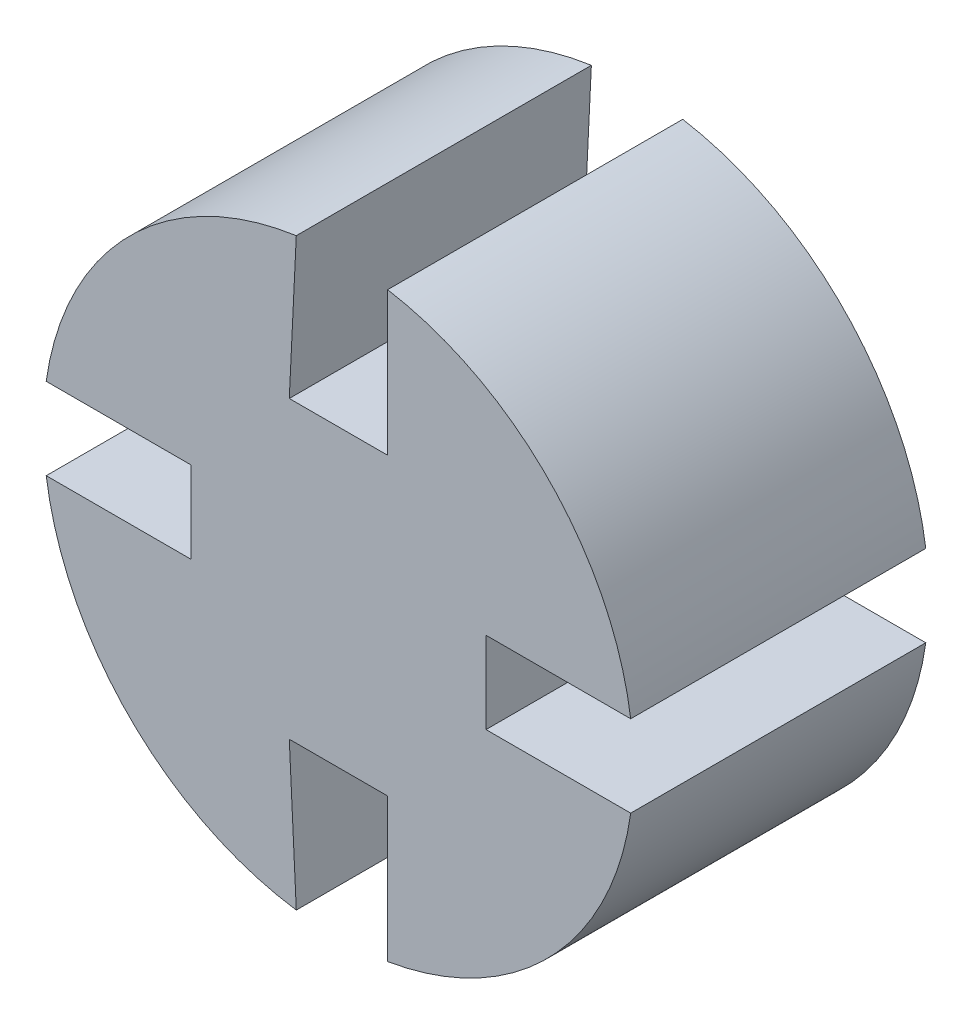
ISO-10303-21;
HEADER;
FILE_DESCRIPTION(('STEP AP214'),'2;1');
FILE_NAME('part.step','',(''),(''),'','','');
FILE_SCHEMA(('AUTOMOTIVE_DESIGN { 1 0 10303 214 1 1 1 1 }'));
ENDSEC;
DATA;
#1=APPLICATION_CONTEXT('core data for automotive mechanical design processes');
#2=APPLICATION_PROTOCOL_DEFINITION('international standard','automotive_design',2000,#1);
#3=PRODUCT_CONTEXT('',#1,'mechanical');
#4=PRODUCT('Part','Part','',(#3));
#5=PRODUCT_RELATED_PRODUCT_CATEGORY('part','',(#4));
#6=PRODUCT_DEFINITION_FORMATION('','',#4);
#7=PRODUCT_DEFINITION_CONTEXT('part definition',#1,'design');
#8=PRODUCT_DEFINITION('design','',#6,#7);
#9=PRODUCT_DEFINITION_SHAPE('','',#8);
#10=(LENGTH_UNIT() NAMED_UNIT(*) SI_UNIT(.MILLI.,.METRE.));
#11=(NAMED_UNIT(*) PLANE_ANGLE_UNIT() SI_UNIT($,.RADIAN.));
#12=(NAMED_UNIT(*) SI_UNIT($,.STERADIAN.) SOLID_ANGLE_UNIT());
#13=UNCERTAINTY_MEASURE_WITH_UNIT(LENGTH_MEASURE(1.E-05),#10,'distance_accuracy_value','');
#14=(GEOMETRIC_REPRESENTATION_CONTEXT(3) GLOBAL_UNCERTAINTY_ASSIGNED_CONTEXT((#13)) GLOBAL_UNIT_ASSIGNED_CONTEXT((#10,
#11,#12)) REPRESENTATION_CONTEXT('',''));
#15=CARTESIAN_POINT('',(0.,0.,0.));
#16=DIRECTION('',(0.,0.,1.));
#17=DIRECTION('',(1.,0.,0.));
#18=AXIS2_PLACEMENT_3D('',#15,#16,#17);
#19=CARTESIAN_POINT('',(0.,0.,60.));
#20=DIRECTION('',(0.,0.,-1.));
#21=DIRECTION('',(-1.,0.,0.));
#22=AXIS2_PLACEMENT_3D('',#19,#20,#21);
#23=CYLINDRICAL_SURFACE('',#22,60.);
#24=CARTESIAN_POINT('',(0.,0.,0.));
#25=DIRECTION('',(0.,0.,1.));
#26=DIRECTION('',(1.,0.,0.));
#27=AXIS2_PLACEMENT_3D('',#24,#25,#26);
#28=CIRCLE('',#27,60.);
#29=CARTESIAN_POINT('',(59.422289673642,8.30611160181319,0.));
#30=VERTEX_POINT('',#29);
#31=CARTESIAN_POINT('',(10.,59.1607978309962,0.));
#32=VERTEX_POINT('',#31);
#33=EDGE_CURVE('E177',#30,#32,#28,.T.);
#34=ORIENTED_EDGE('',*,*,#33,.T.);
#35=DIRECTION('',(0.,0.,-1.));
#36=VECTOR('',#35,1.);
#37=CARTESIAN_POINT('',(10.,59.1607978309962,60.));
#38=LINE('',#37,#36);
#39=CARTESIAN_POINT('',(10.,59.1607978309962,60.));
#40=VERTEX_POINT('',#39);
#41=EDGE_CURVE('E11',#40,#32,#38,.T.);
#42=ORIENTED_EDGE('',*,*,#41,.F.);
#43=CARTESIAN_POINT('',(0.,0.,60.));
#44=DIRECTION('',(0.,0.,1.));
#45=DIRECTION('',(1.,0.,0.));
#46=AXIS2_PLACEMENT_3D('',#43,#44,#45);
#47=CIRCLE('',#46,60.);
#48=CARTESIAN_POINT('',(59.422289673642,8.30611160181319,60.));
#49=VERTEX_POINT('',#48);
#50=EDGE_CURVE('E207',#49,#40,#47,.T.);
#51=ORIENTED_EDGE('',*,*,#50,.F.);
#52=DIRECTION('',(0.,0.,-1.));
#53=VECTOR('',#52,1.);
#54=CARTESIAN_POINT('',(59.422289673642,8.30611160181319,60.));
#55=LINE('',#54,#53);
#56=EDGE_CURVE('E173',#49,#30,#55,.T.);
#57=ORIENTED_EDGE('',*,*,#56,.T.);
#58=EDGE_LOOP('',(#34,#42,#51,#57));
#59=FACE_BOUND('',#58,.T.);
#60=ADVANCED_FACE('F33',(#59),#23,.T.);
#61=CARTESIAN_POINT('',(10.,59.1607978309962,60.));
#62=DIRECTION('',(1.,0.,0.));
#63=DIRECTION('',(0.,1.,0.));
#64=AXIS2_PLACEMENT_3D('',#61,#62,#63);
#65=PLANE('',#64);
#66=DIRECTION('',(0.,-1.,0.));
#67=VECTOR('',#66,1.);
#68=CARTESIAN_POINT('',(10.,59.1607978309962,0.));
#69=LINE('',#68,#67);
#70=CARTESIAN_POINT('',(9.99999999999999,30.,0.));
#71=VERTEX_POINT('',#70);
#72=EDGE_CURVE('E180',#32,#71,#69,.T.);
#73=ORIENTED_EDGE('',*,*,#72,.T.);
#74=DIRECTION('',(0.,0.,-1.));
#75=VECTOR('',#74,1.);
#76=CARTESIAN_POINT('',(9.99999999999999,30.,60.));
#77=LINE('',#76,#75);
#78=CARTESIAN_POINT('',(9.99999999999999,30.,60.));
#79=VERTEX_POINT('',#78);
#80=EDGE_CURVE('E41',#79,#71,#77,.T.);
#81=ORIENTED_EDGE('',*,*,#80,.F.);
#82=DIRECTION('',(0.,-1.,0.));
#83=VECTOR('',#82,1.);
#84=CARTESIAN_POINT('',(10.,59.1607978309962,60.));
#85=LINE('',#84,#83);
#86=EDGE_CURVE('E116',#40,#79,#85,.T.);
#87=ORIENTED_EDGE('',*,*,#86,.F.);
#88=ORIENTED_EDGE('',*,*,#41,.T.);
#89=EDGE_LOOP('',(#73,#81,#87,#88));
#90=FACE_BOUND('',#89,.T.);
#91=ADVANCED_FACE('F305',(#90),#65,.F.);
#92=CARTESIAN_POINT('',(-10.,30.,60.));
#93=DIRECTION('',(0.,-1.,0.));
#94=DIRECTION('',(1.,0.,0.));
#95=AXIS2_PLACEMENT_3D('',#92,#93,#94);
#96=PLANE('',#95);
#97=DIRECTION('',(-1.,0.,0.));
#98=VECTOR('',#97,1.);
#99=CARTESIAN_POINT('',(-10.,30.,0.));
#100=LINE('',#99,#98);
#101=CARTESIAN_POINT('',(-10.,30.,0.));
#102=VERTEX_POINT('',#101);
#103=EDGE_CURVE('E182',#71,#102,#100,.T.);
#104=ORIENTED_EDGE('',*,*,#103,.T.);
#105=DIRECTION('',(0.,0.,-1.));
#106=VECTOR('',#105,1.);
#107=CARTESIAN_POINT('',(-10.,30.,60.));
#108=LINE('',#107,#106);
#109=CARTESIAN_POINT('',(-10.,30.,60.));
#110=VERTEX_POINT('',#109);
#111=EDGE_CURVE('E238',#110,#102,#108,.T.);
#112=ORIENTED_EDGE('',*,*,#111,.F.);
#113=DIRECTION('',(-1.,0.,0.));
#114=VECTOR('',#113,1.);
#115=CARTESIAN_POINT('',(-10.,30.,60.));
#116=LINE('',#115,#114);
#117=EDGE_CURVE('E246',#79,#110,#116,.T.);
#118=ORIENTED_EDGE('',*,*,#117,.F.);
#119=ORIENTED_EDGE('',*,*,#80,.T.);
#120=EDGE_LOOP('',(#104,#112,#118,#119));
#121=FACE_BOUND('',#120,.T.);
#122=ADVANCED_FACE('F244',(#121),#96,.F.);
#123=CARTESIAN_POINT('',(-8.57523763049704,59.3840492016207,60.));
#124=DIRECTION('',(-0.998826544486309,0.0484307137004888,0.));
#125=DIRECTION('',(-0.0484307137004888,-0.998826544486309,0.));
#126=AXIS2_PLACEMENT_3D('',#123,#124,#125);
#127=PLANE('',#126);
#128=DIRECTION('',(0.0484307137004888,0.998826544486309,0.));
#129=VECTOR('',#128,1.);
#130=CARTESIAN_POINT('',(-8.57523763049704,59.3840492016207,0.));
#131=LINE('',#130,#129);
#132=CARTESIAN_POINT('',(-8.57523763049704,59.3840492016207,0.));
#133=VERTEX_POINT('',#132);
#134=EDGE_CURVE('E184',#102,#133,#131,.T.);
#135=ORIENTED_EDGE('',*,*,#134,.T.);
#136=DIRECTION('',(0.,0.,-1.));
#137=VECTOR('',#136,1.);
#138=CARTESIAN_POINT('',(-8.57523763049704,59.3840492016207,60.));
#139=LINE('',#138,#137);
#140=CARTESIAN_POINT('',(-8.57523763049704,59.3840492016207,60.));
#141=VERTEX_POINT('',#140);
#142=EDGE_CURVE('E235',#141,#133,#139,.T.);
#143=ORIENTED_EDGE('',*,*,#142,.F.);
#144=DIRECTION('',(0.0484307137004888,0.998826544486309,0.));
#145=VECTOR('',#144,1.);
#146=CARTESIAN_POINT('',(-8.57523763049704,59.3840492016207,60.));
#147=LINE('',#146,#145);
#148=EDGE_CURVE('E264',#110,#141,#147,.T.);
#149=ORIENTED_EDGE('',*,*,#148,.F.);
#150=ORIENTED_EDGE('',*,*,#111,.T.);
#151=EDGE_LOOP('',(#135,#143,#149,#150));
#152=FACE_BOUND('',#151,.T.);
#153=ADVANCED_FACE('F255',(#152),#127,.F.);
#154=CARTESIAN_POINT('',(0.,0.,60.));
#155=DIRECTION('',(0.,0.,-1.));
#156=DIRECTION('',(-1.,0.,0.));
#157=AXIS2_PLACEMENT_3D('',#154,#155,#156);
#158=CYLINDRICAL_SURFACE('',#157,60.);
#159=CARTESIAN_POINT('',(0.,0.,0.));
#160=DIRECTION('',(0.,0.,1.));
#161=DIRECTION('',(1.,0.,0.));
#162=AXIS2_PLACEMENT_3D('',#159,#160,#161);
#163=CIRCLE('',#162,60.);
#164=CARTESIAN_POINT('',(-59.422289673642,8.30611160181319,0.));
#165=VERTEX_POINT('',#164);
#166=EDGE_CURVE('E186',#133,#165,#163,.T.);
#167=ORIENTED_EDGE('',*,*,#166,.T.);
#168=DIRECTION('',(0.,0.,-1.));
#169=VECTOR('',#168,1.);
#170=CARTESIAN_POINT('',(-59.422289673642,8.30611160181319,60.));
#171=LINE('',#170,#169);
#172=CARTESIAN_POINT('',(-59.422289673642,8.30611160181319,60.));
#173=VERTEX_POINT('',#172);
#174=EDGE_CURVE('E232',#173,#165,#171,.T.);
#175=ORIENTED_EDGE('',*,*,#174,.F.);
#176=CARTESIAN_POINT('',(0.,0.,60.));
#177=DIRECTION('',(0.,0.,1.));
#178=DIRECTION('',(1.,0.,0.));
#179=AXIS2_PLACEMENT_3D('',#176,#177,#178);
#180=CIRCLE('',#179,60.);
#181=EDGE_CURVE('E261',#141,#173,#180,.T.);
#182=ORIENTED_EDGE('',*,*,#181,.F.);
#183=ORIENTED_EDGE('',*,*,#142,.T.);
#184=EDGE_LOOP('',(#167,#175,#182,#183));
#185=FACE_BOUND('',#184,.T.);
#186=ADVANCED_FACE('F259',(#185),#158,.T.);
#187=CARTESIAN_POINT('',(-59.422289673642,8.30611160181319,60.));
#188=DIRECTION('',(0.,1.,0.));
#189=DIRECTION('',(0.,0.,1.));
#190=AXIS2_PLACEMENT_3D('',#187,#188,#189);
#191=PLANE('',#190);
#192=DIRECTION('',(1.,0.,0.));
#193=VECTOR('',#192,1.);
#194=CARTESIAN_POINT('',(-59.422289673642,8.30611160181319,0.));
#195=LINE('',#194,#193);
#196=CARTESIAN_POINT('',(-30.,8.30611160181319,0.));
#197=VERTEX_POINT('',#196);
#198=EDGE_CURVE('E188',#165,#197,#195,.T.);
#199=ORIENTED_EDGE('',*,*,#198,.T.);
#200=DIRECTION('',(0.,0.,-1.));
#201=VECTOR('',#200,1.);
#202=CARTESIAN_POINT('',(-30.,8.30611160181319,60.));
#203=LINE('',#202,#201);
#204=CARTESIAN_POINT('',(-30.,8.30611160181319,60.));
#205=VERTEX_POINT('',#204);
#206=EDGE_CURVE('E229',#205,#197,#203,.T.);
#207=ORIENTED_EDGE('',*,*,#206,.F.);
#208=DIRECTION('',(1.,0.,0.));
#209=VECTOR('',#208,1.);
#210=CARTESIAN_POINT('',(-59.422289673642,8.30611160181319,60.));
#211=LINE('',#210,#209);
#212=EDGE_CURVE('E263',#173,#205,#211,.T.);
#213=ORIENTED_EDGE('',*,*,#212,.F.);
#214=ORIENTED_EDGE('',*,*,#174,.T.);
#215=EDGE_LOOP('',(#199,#207,#213,#214));
#216=FACE_BOUND('',#215,.T.);
#217=ADVANCED_FACE('F318',(#216),#191,.F.);
#218=CARTESIAN_POINT('',(-30.,8.30611160181319,60.));
#219=DIRECTION('',(1.,0.,0.));
#220=DIRECTION('',(0.,0.,-1.));
#221=AXIS2_PLACEMENT_3D('',#218,#219,#220);
#222=PLANE('',#221);
#223=DIRECTION('',(0.,-1.,0.));
#224=VECTOR('',#223,1.);
#225=CARTESIAN_POINT('',(-30.,8.30611160181319,0.));
#226=LINE('',#225,#224);
#227=CARTESIAN_POINT('',(-30.,-8.30611160181316,0.));
#228=VERTEX_POINT('',#227);
#229=EDGE_CURVE('E190',#197,#228,#226,.T.);
#230=ORIENTED_EDGE('',*,*,#229,.T.);
#231=DIRECTION('',(0.,0.,-1.));
#232=VECTOR('',#231,1.);
#233=CARTESIAN_POINT('',(-30.,-8.30611160181316,60.));
#234=LINE('',#233,#232);
#235=CARTESIAN_POINT('',(-30.,-8.30611160181316,60.));
#236=VERTEX_POINT('',#235);
#237=EDGE_CURVE('E226',#236,#228,#234,.T.);
#238=ORIENTED_EDGE('',*,*,#237,.F.);
#239=DIRECTION('',(0.,-1.,0.));
#240=VECTOR('',#239,1.);
#241=CARTESIAN_POINT('',(-30.,8.30611160181319,60.));
#242=LINE('',#241,#240);
#243=EDGE_CURVE('E266',#205,#236,#242,.T.);
#244=ORIENTED_EDGE('',*,*,#243,.F.);
#245=ORIENTED_EDGE('',*,*,#206,.T.);
#246=EDGE_LOOP('',(#230,#238,#244,#245));
#247=FACE_BOUND('',#246,.T.);
#248=ADVANCED_FACE('F321',(#247),#222,.F.);
#249=CARTESIAN_POINT('',(-59.422289673642,-8.30611160181317,60.));
#250=DIRECTION('',(0.,-1.,0.));
#251=DIRECTION('',(1.,0.,0.));
#252=AXIS2_PLACEMENT_3D('',#249,#250,#251);
#253=PLANE('',#252);
#254=DIRECTION('',(-1.,0.,0.));
#255=VECTOR('',#254,1.);
#256=CARTESIAN_POINT('',(-59.422289673642,-8.30611160181317,0.));
#257=LINE('',#256,#255);
#258=CARTESIAN_POINT('',(-59.422289673642,-8.30611160181317,0.));
#259=VERTEX_POINT('',#258);
#260=EDGE_CURVE('E192',#228,#259,#257,.T.);
#261=ORIENTED_EDGE('',*,*,#260,.T.);
#262=DIRECTION('',(0.,0.,-1.));
#263=VECTOR('',#262,1.);
#264=CARTESIAN_POINT('',(-59.422289673642,-8.30611160181317,60.));
#265=LINE('',#264,#263);
#266=CARTESIAN_POINT('',(-59.422289673642,-8.30611160181317,60.));
#267=VERTEX_POINT('',#266);
#268=EDGE_CURVE('E223',#267,#259,#265,.T.);
#269=ORIENTED_EDGE('',*,*,#268,.F.);
#270=DIRECTION('',(-1.,0.,0.));
#271=VECTOR('',#270,1.);
#272=CARTESIAN_POINT('',(-59.422289673642,-8.30611160181317,60.));
#273=LINE('',#272,#271);
#274=EDGE_CURVE('E272',#236,#267,#273,.T.);
#275=ORIENTED_EDGE('',*,*,#274,.F.);
#276=ORIENTED_EDGE('',*,*,#237,.T.);
#277=EDGE_LOOP('',(#261,#269,#275,#276));
#278=FACE_BOUND('',#277,.T.);
#279=ADVANCED_FACE('F325',(#278),#253,.F.);
#280=CARTESIAN_POINT('',(0.,0.,60.));
#281=DIRECTION('',(0.,0.,-1.));
#282=DIRECTION('',(-1.,0.,0.));
#283=AXIS2_PLACEMENT_3D('',#280,#281,#282);
#284=CYLINDRICAL_SURFACE('',#283,60.);
#285=CARTESIAN_POINT('',(0.,0.,0.));
#286=DIRECTION('',(0.,0.,1.));
#287=DIRECTION('',(1.,0.,0.));
#288=AXIS2_PLACEMENT_3D('',#285,#286,#287);
#289=CIRCLE('',#288,60.);
#290=CARTESIAN_POINT('',(-8.57523763049706,-59.3840492016207,0.));
#291=VERTEX_POINT('',#290);
#292=EDGE_CURVE('E194',#259,#291,#289,.T.);
#293=ORIENTED_EDGE('',*,*,#292,.T.);
#294=DIRECTION('',(0.,0.,-1.));
#295=VECTOR('',#294,1.);
#296=CARTESIAN_POINT('',(-8.57523763049706,-59.3840492016207,60.));
#297=LINE('',#296,#295);
#298=CARTESIAN_POINT('',(-8.57523763049706,-59.3840492016207,60.));
#299=VERTEX_POINT('',#298);
#300=EDGE_CURVE('E220',#299,#291,#297,.T.);
#301=ORIENTED_EDGE('',*,*,#300,.F.);
#302=CARTESIAN_POINT('',(0.,0.,60.));
#303=DIRECTION('',(0.,0.,1.));
#304=DIRECTION('',(1.,0.,0.));
#305=AXIS2_PLACEMENT_3D('',#302,#303,#304);
#306=CIRCLE('',#305,60.);
#307=EDGE_CURVE('E274',#267,#299,#306,.T.);
#308=ORIENTED_EDGE('',*,*,#307,.F.);
#309=ORIENTED_EDGE('',*,*,#268,.T.);
#310=EDGE_LOOP('',(#293,#301,#308,#309));
#311=FACE_BOUND('',#310,.T.);
#312=ADVANCED_FACE('F329',(#311),#284,.T.);
#313=CARTESIAN_POINT('',(-8.57523763049704,-59.3840492016207,60.));
#314=DIRECTION('',(-0.998826544486309,-0.0484307137004886,0.));
#315=DIRECTION('',(0.0484307137004886,-0.998826544486309,0.));
#316=AXIS2_PLACEMENT_3D('',#313,#314,#315);
#317=PLANE('',#316);
#318=DIRECTION('',(-0.0484307137004886,0.998826544486309,0.));
#319=VECTOR('',#318,1.);
#320=CARTESIAN_POINT('',(-8.57523763049704,-59.3840492016207,0.));
#321=LINE('',#320,#319);
#322=CARTESIAN_POINT('',(-10.,-30.,0.));
#323=VERTEX_POINT('',#322);
#324=EDGE_CURVE('E196',#291,#323,#321,.T.);
#325=ORIENTED_EDGE('',*,*,#324,.T.);
#326=DIRECTION('',(0.,0.,-1.));
#327=VECTOR('',#326,1.);
#328=CARTESIAN_POINT('',(-10.,-30.,60.));
#329=LINE('',#328,#327);
#330=CARTESIAN_POINT('',(-10.,-30.,60.));
#331=VERTEX_POINT('',#330);
#332=EDGE_CURVE('E217',#331,#323,#329,.T.);
#333=ORIENTED_EDGE('',*,*,#332,.F.);
#334=DIRECTION('',(-0.0484307137004886,0.998826544486309,0.));
#335=VECTOR('',#334,1.);
#336=CARTESIAN_POINT('',(-8.57523763049704,-59.3840492016207,60.));
#337=LINE('',#336,#335);
#338=EDGE_CURVE('E276',#299,#331,#337,.T.);
#339=ORIENTED_EDGE('',*,*,#338,.F.);
#340=ORIENTED_EDGE('',*,*,#300,.T.);
#341=EDGE_LOOP('',(#325,#333,#339,#340));
#342=FACE_BOUND('',#341,.T.);
#343=ADVANCED_FACE('F333',(#342),#317,.F.);
#344=CARTESIAN_POINT('',(-10.,-30.,60.));
#345=DIRECTION('',(0.,1.,0.));
#346=DIRECTION('',(-1.,0.,0.));
#347=AXIS2_PLACEMENT_3D('',#344,#345,#346);
#348=PLANE('',#347);
#349=DIRECTION('',(1.,0.,0.));
#350=VECTOR('',#349,1.);
#351=CARTESIAN_POINT('',(-10.,-30.,0.));
#352=LINE('',#351,#350);
#353=CARTESIAN_POINT('',(10.,-30.,0.));
#354=VERTEX_POINT('',#353);
#355=EDGE_CURVE('E198',#323,#354,#352,.T.);
#356=ORIENTED_EDGE('',*,*,#355,.T.);
#357=DIRECTION('',(0.,0.,-1.));
#358=VECTOR('',#357,1.);
#359=CARTESIAN_POINT('',(10.,-30.,60.));
#360=LINE('',#359,#358);
#361=CARTESIAN_POINT('',(10.,-30.,60.));
#362=VERTEX_POINT('',#361);
#363=EDGE_CURVE('E214',#362,#354,#360,.T.);
#364=ORIENTED_EDGE('',*,*,#363,.F.);
#365=DIRECTION('',(1.,0.,0.));
#366=VECTOR('',#365,1.);
#367=CARTESIAN_POINT('',(-10.,-30.,60.));
#368=LINE('',#367,#366);
#369=EDGE_CURVE('E278',#331,#362,#368,.T.);
#370=ORIENTED_EDGE('',*,*,#369,.F.);
#371=ORIENTED_EDGE('',*,*,#332,.T.);
#372=EDGE_LOOP('',(#356,#364,#370,#371));
#373=FACE_BOUND('',#372,.T.);
#374=ADVANCED_FACE('F337',(#373),#348,.F.);
#375=CARTESIAN_POINT('',(10.,-59.1607978309962,60.));
#376=DIRECTION('',(1.,0.,0.));
#377=DIRECTION('',(0.,0.,-1.));
#378=AXIS2_PLACEMENT_3D('',#375,#376,#377);
#379=PLANE('',#378);
#380=DIRECTION('',(0.,-1.,0.));
#381=VECTOR('',#380,1.);
#382=CARTESIAN_POINT('',(10.,-59.1607978309962,0.));
#383=LINE('',#382,#381);
#384=CARTESIAN_POINT('',(10.,-59.1607978309962,0.));
#385=VERTEX_POINT('',#384);
#386=EDGE_CURVE('E200',#354,#385,#383,.T.);
#387=ORIENTED_EDGE('',*,*,#386,.T.);
#388=DIRECTION('',(0.,0.,-1.));
#389=VECTOR('',#388,1.);
#390=CARTESIAN_POINT('',(10.,-59.1607978309962,60.));
#391=LINE('',#390,#389);
#392=CARTESIAN_POINT('',(10.,-59.1607978309962,60.));
#393=VERTEX_POINT('',#392);
#394=EDGE_CURVE('E211',#393,#385,#391,.T.);
#395=ORIENTED_EDGE('',*,*,#394,.F.);
#396=DIRECTION('',(0.,-1.,0.));
#397=VECTOR('',#396,1.);
#398=CARTESIAN_POINT('',(10.,-59.1607978309962,60.));
#399=LINE('',#398,#397);
#400=EDGE_CURVE('E280',#362,#393,#399,.T.);
#401=ORIENTED_EDGE('',*,*,#400,.F.);
#402=ORIENTED_EDGE('',*,*,#363,.T.);
#403=EDGE_LOOP('',(#387,#395,#401,#402));
#404=FACE_BOUND('',#403,.T.);
#405=ADVANCED_FACE('F286',(#404),#379,.F.);
#406=CARTESIAN_POINT('',(0.,0.,60.));
#407=DIRECTION('',(0.,0.,-1.));
#408=DIRECTION('',(-1.,0.,0.));
#409=AXIS2_PLACEMENT_3D('',#406,#407,#408);
#410=CYLINDRICAL_SURFACE('',#409,60.);
#411=CARTESIAN_POINT('',(0.,0.,0.));
#412=DIRECTION('',(0.,0.,1.));
#413=DIRECTION('',(1.,0.,0.));
#414=AXIS2_PLACEMENT_3D('',#411,#412,#413);
#415=CIRCLE('',#414,60.);
#416=CARTESIAN_POINT('',(59.422289673642,-8.30611160181319,0.));
#417=VERTEX_POINT('',#416);
#418=EDGE_CURVE('E202',#385,#417,#415,.T.);
#419=ORIENTED_EDGE('',*,*,#418,.T.);
#420=DIRECTION('',(0.,0.,-1.));
#421=VECTOR('',#420,1.);
#422=CARTESIAN_POINT('',(59.422289673642,-8.30611160181319,60.));
#423=LINE('',#422,#421);
#424=CARTESIAN_POINT('',(59.422289673642,-8.30611160181319,60.));
#425=VERTEX_POINT('',#424);
#426=EDGE_CURVE('E168',#425,#417,#423,.T.);
#427=ORIENTED_EDGE('',*,*,#426,.F.);
#428=CARTESIAN_POINT('',(0.,0.,60.));
#429=DIRECTION('',(0.,0.,1.));
#430=DIRECTION('',(1.,0.,0.));
#431=AXIS2_PLACEMENT_3D('',#428,#429,#430);
#432=CIRCLE('',#431,60.);
#433=EDGE_CURVE('E159',#393,#425,#432,.T.);
#434=ORIENTED_EDGE('',*,*,#433,.F.);
#435=ORIENTED_EDGE('',*,*,#394,.T.);
#436=EDGE_LOOP('',(#419,#427,#434,#435));
#437=FACE_BOUND('',#436,.T.);
#438=ADVANCED_FACE('F290',(#437),#410,.T.);
#439=CARTESIAN_POINT('',(59.422289673642,-8.30611160181317,60.));
#440=DIRECTION('',(0.,-1.,0.));
#441=DIRECTION('',(1.,0.,0.));
#442=AXIS2_PLACEMENT_3D('',#439,#440,#441);
#443=PLANE('',#442);
#444=DIRECTION('',(-1.,0.,0.));
#445=VECTOR('',#444,1.);
#446=CARTESIAN_POINT('',(59.422289673642,-8.30611160181317,0.));
#447=LINE('',#446,#445);
#448=CARTESIAN_POINT('',(30.,-8.30611160181316,0.));
#449=VERTEX_POINT('',#448);
#450=EDGE_CURVE('E167',#417,#449,#447,.T.);
#451=ORIENTED_EDGE('',*,*,#450,.T.);
#452=DIRECTION('',(0.,0.,-1.));
#453=VECTOR('',#452,1.);
#454=CARTESIAN_POINT('',(30.,-8.30611160181316,60.));
#455=LINE('',#454,#453);
#456=CARTESIAN_POINT('',(30.,-8.30611160181316,60.));
#457=VERTEX_POINT('',#456);
#458=EDGE_CURVE('E164',#457,#449,#455,.T.);
#459=ORIENTED_EDGE('',*,*,#458,.F.);
#460=DIRECTION('',(-1.,0.,0.));
#461=VECTOR('',#460,1.);
#462=CARTESIAN_POINT('',(59.422289673642,-8.30611160181317,60.));
#463=LINE('',#462,#461);
#464=EDGE_CURVE('E153',#425,#457,#463,.T.);
#465=ORIENTED_EDGE('',*,*,#464,.F.);
#466=ORIENTED_EDGE('',*,*,#426,.T.);
#467=EDGE_LOOP('',(#451,#459,#465,#466));
#468=FACE_BOUND('',#467,.T.);
#469=ADVANCED_FACE('F165',(#468),#443,.F.);
#470=CARTESIAN_POINT('',(30.,8.30611160181319,60.));
#471=DIRECTION('',(-1.,0.,0.));
#472=DIRECTION('',(0.,0.,1.));
#473=AXIS2_PLACEMENT_3D('',#470,#471,#472);
#474=PLANE('',#473);
#475=DIRECTION('',(0.,1.,0.));
#476=VECTOR('',#475,1.);
#477=CARTESIAN_POINT('',(30.,8.30611160181319,0.));
#478=LINE('',#477,#476);
#479=CARTESIAN_POINT('',(30.,8.30611160181319,0.));
#480=VERTEX_POINT('',#479);
#481=EDGE_CURVE('E102',#449,#480,#478,.T.);
#482=ORIENTED_EDGE('',*,*,#481,.T.);
#483=DIRECTION('',(0.,0.,-1.));
#484=VECTOR('',#483,1.);
#485=CARTESIAN_POINT('',(30.,8.30611160181319,60.));
#486=LINE('',#485,#484);
#487=CARTESIAN_POINT('',(30.,8.30611160181319,60.));
#488=VERTEX_POINT('',#487);
#489=EDGE_CURVE('E169',#488,#480,#486,.T.);
#490=ORIENTED_EDGE('',*,*,#489,.F.);
#491=DIRECTION('',(0.,1.,0.));
#492=VECTOR('',#491,1.);
#493=CARTESIAN_POINT('',(30.,8.30611160181319,60.));
#494=LINE('',#493,#492);
#495=EDGE_CURVE('E157',#457,#488,#494,.T.);
#496=ORIENTED_EDGE('',*,*,#495,.F.);
#497=ORIENTED_EDGE('',*,*,#458,.T.);
#498=EDGE_LOOP('',(#482,#490,#496,#497));
#499=FACE_BOUND('',#498,.T.);
#500=ADVANCED_FACE('F171',(#499),#474,.F.);
#501=CARTESIAN_POINT('',(59.422289673642,8.30611160181319,60.));
#502=DIRECTION('',(0.,1.,0.));
#503=DIRECTION('',(0.,0.,1.));
#504=AXIS2_PLACEMENT_3D('',#501,#502,#503);
#505=PLANE('',#504);
#506=DIRECTION('',(1.,0.,0.));
#507=VECTOR('',#506,1.);
#508=CARTESIAN_POINT('',(59.422289673642,8.30611160181319,0.));
#509=LINE('',#508,#507);
#510=EDGE_CURVE('E108',#480,#30,#509,.T.);
#511=ORIENTED_EDGE('',*,*,#510,.T.);
#512=ORIENTED_EDGE('',*,*,#56,.F.);
#513=DIRECTION('',(1.,0.,0.));
#514=VECTOR('',#513,1.);
#515=CARTESIAN_POINT('',(59.422289673642,8.30611160181319,60.));
#516=LINE('',#515,#514);
#517=EDGE_CURVE('E49',#488,#49,#516,.T.);
#518=ORIENTED_EDGE('',*,*,#517,.F.);
#519=ORIENTED_EDGE('',*,*,#489,.T.);
#520=EDGE_LOOP('',(#511,#512,#518,#519));
#521=FACE_BOUND('',#520,.T.);
#522=ADVANCED_FACE('F294',(#521),#505,.F.);
#523=CARTESIAN_POINT('',(0.,0.,60.));
#524=DIRECTION('',(0.,0.,1.));
#525=DIRECTION('',(1.,0.,0.));
#526=AXIS2_PLACEMENT_3D('',#523,#524,#525);
#527=PLANE('',#526);
#528=ORIENTED_EDGE('',*,*,#50,.T.);
#529=ORIENTED_EDGE('',*,*,#86,.T.);
#530=ORIENTED_EDGE('',*,*,#117,.T.);
#531=ORIENTED_EDGE('',*,*,#148,.T.);
#532=ORIENTED_EDGE('',*,*,#181,.T.);
#533=ORIENTED_EDGE('',*,*,#212,.T.);
#534=ORIENTED_EDGE('',*,*,#243,.T.);
#535=ORIENTED_EDGE('',*,*,#274,.T.);
#536=ORIENTED_EDGE('',*,*,#307,.T.);
#537=ORIENTED_EDGE('',*,*,#338,.T.);
#538=ORIENTED_EDGE('',*,*,#369,.T.);
#539=ORIENTED_EDGE('',*,*,#400,.T.);
#540=ORIENTED_EDGE('',*,*,#433,.T.);
#541=ORIENTED_EDGE('',*,*,#464,.T.);
#542=ORIENTED_EDGE('',*,*,#495,.T.);
#543=ORIENTED_EDGE('',*,*,#517,.T.);
#544=EDGE_LOOP('',(#528,#529,#530,#531,#532,#533,#534,#535,#536,#537,#538,#539,#540,#541,#542,#543));
#545=FACE_BOUND('',#544,.T.);
#546=ADVANCED_FACE('F155',(#545),#527,.T.);
#547=CARTESIAN_POINT('',(0.,0.,0.));
#548=DIRECTION('',(0.,0.,1.));
#549=DIRECTION('',(1.,0.,0.));
#550=AXIS2_PLACEMENT_3D('',#547,#548,#549);
#551=PLANE('',#550);
#552=ORIENTED_EDGE('',*,*,#33,.F.);
#553=ORIENTED_EDGE('',*,*,#510,.F.);
#554=ORIENTED_EDGE('',*,*,#481,.F.);
#555=ORIENTED_EDGE('',*,*,#450,.F.);
#556=ORIENTED_EDGE('',*,*,#418,.F.);
#557=ORIENTED_EDGE('',*,*,#386,.F.);
#558=ORIENTED_EDGE('',*,*,#355,.F.);
#559=ORIENTED_EDGE('',*,*,#324,.F.);
#560=ORIENTED_EDGE('',*,*,#292,.F.);
#561=ORIENTED_EDGE('',*,*,#260,.F.);
#562=ORIENTED_EDGE('',*,*,#229,.F.);
#563=ORIENTED_EDGE('',*,*,#198,.F.);
#564=ORIENTED_EDGE('',*,*,#166,.F.);
#565=ORIENTED_EDGE('',*,*,#134,.F.);
#566=ORIENTED_EDGE('',*,*,#103,.F.);
#567=ORIENTED_EDGE('',*,*,#72,.F.);
#568=EDGE_LOOP('',(#552,#553,#554,#555,#556,#557,#558,#559,#560,#561,#562,#563,#564,#565,#566,#567));
#569=FACE_BOUND('',#568,.T.);
#570=ADVANCED_FACE('F250',(#569),#551,.F.);
#571=CLOSED_SHELL('',(#60,#91,#122,#153,#186,#217,#248,#279,#312,#343,#374,#405,#438,#469,#500,
#522,#546,#570));
#572=MANIFOLD_SOLID_BREP('B2',#571);
#573=ADVANCED_BREP_SHAPE_REPRESENTATION('',(#18,#572),#14);
#574=SHAPE_DEFINITION_REPRESENTATION(#9,#573);
ENDSEC;
END-ISO-10303-21;
